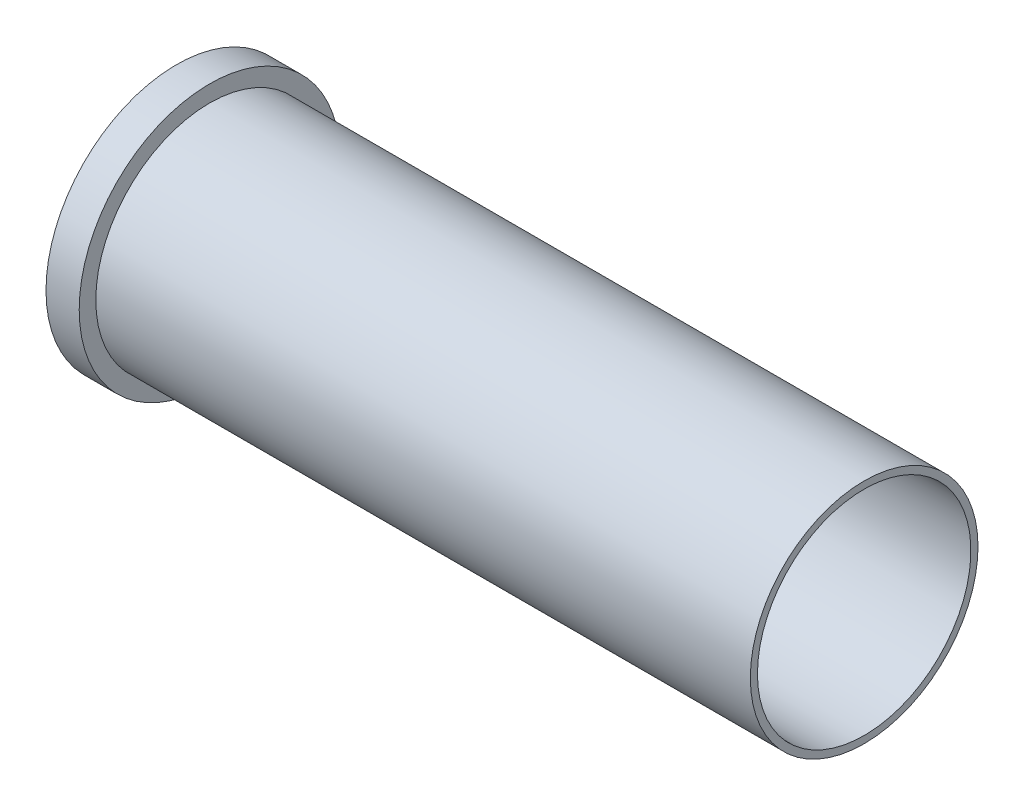
ISO-10303-21;
HEADER;
FILE_DESCRIPTION(('STEP AP214'),'2;1');
FILE_NAME('part.step','',(''),(''),'','','');
FILE_SCHEMA(('AUTOMOTIVE_DESIGN { 1 0 10303 214 1 1 1 1 }'));
ENDSEC;
DATA;
#1=APPLICATION_CONTEXT('core data for automotive mechanical design processes');
#2=APPLICATION_PROTOCOL_DEFINITION('international standard','automotive_design',2000,#1);
#3=PRODUCT_CONTEXT('',#1,'mechanical');
#4=PRODUCT('Part','Part','',(#3));
#5=PRODUCT_RELATED_PRODUCT_CATEGORY('part','',(#4));
#6=PRODUCT_DEFINITION_FORMATION('','',#4);
#7=PRODUCT_DEFINITION_CONTEXT('part definition',#1,'design');
#8=PRODUCT_DEFINITION('design','',#6,#7);
#9=PRODUCT_DEFINITION_SHAPE('','',#8);
#10=(LENGTH_UNIT() NAMED_UNIT(*) SI_UNIT(.MILLI.,.METRE.));
#11=(NAMED_UNIT(*) PLANE_ANGLE_UNIT() SI_UNIT($,.RADIAN.));
#12=(NAMED_UNIT(*) SI_UNIT($,.STERADIAN.) SOLID_ANGLE_UNIT());
#13=UNCERTAINTY_MEASURE_WITH_UNIT(LENGTH_MEASURE(1.E-05),#10,'distance_accuracy_value','');
#14=(GEOMETRIC_REPRESENTATION_CONTEXT(3) GLOBAL_UNCERTAINTY_ASSIGNED_CONTEXT((#13)) GLOBAL_UNIT_ASSIGNED_CONTEXT((#10,
#11,#12)) REPRESENTATION_CONTEXT('',''));
#15=CARTESIAN_POINT('',(0.,0.,0.));
#16=DIRECTION('',(0.,0.,1.));
#17=DIRECTION('',(1.,0.,0.));
#18=AXIS2_PLACEMENT_3D('',#15,#16,#17);
#19=CARTESIAN_POINT('',(0.,0.,0.));
#20=DIRECTION('',(-1.,0.,0.));
#21=DIRECTION('',(0.,0.,1.));
#22=AXIS2_PLACEMENT_3D('',#19,#20,#21);
#23=CYLINDRICAL_SURFACE('',#22,2.25);
#24=CARTESIAN_POINT('',(3.,0.,0.));
#25=DIRECTION('',(-1.,0.,0.));
#26=DIRECTION('',(0.,0.,1.));
#27=AXIS2_PLACEMENT_3D('',#24,#25,#26);
#28=CIRCLE('',#27,2.25);
#29=CARTESIAN_POINT('',(3.,0.,2.25));
#30=VERTEX_POINT('',#29);
#31=EDGE_CURVE('E66',#30,#30,#28,.T.);
#32=ORIENTED_EDGE('',*,*,#31,.F.);
#33=EDGE_LOOP('',(#32));
#34=FACE_BOUND('',#33,.T.);
#35=CARTESIAN_POINT('',(0.,0.,0.));
#36=DIRECTION('',(-1.,0.,0.));
#37=DIRECTION('',(0.,0.,1.));
#38=AXIS2_PLACEMENT_3D('',#35,#36,#37);
#39=CIRCLE('',#38,2.25);
#40=CARTESIAN_POINT('',(0.,0.,2.25));
#41=VERTEX_POINT('',#40);
#42=EDGE_CURVE('E10',#41,#41,#39,.T.);
#43=ORIENTED_EDGE('',*,*,#42,.T.);
#44=EDGE_LOOP('',(#43));
#45=FACE_BOUND('',#44,.T.);
#46=ADVANCED_FACE('F32',(#34,#45),#23,.F.);
#47=CARTESIAN_POINT('',(0.,0.,-2.25));
#48=DIRECTION('',(1.,0.,0.));
#49=DIRECTION('',(0.,0.,-1.));
#50=AXIS2_PLACEMENT_3D('',#47,#48,#49);
#51=PLANE('',#50);
#52=ORIENTED_EDGE('',*,*,#42,.F.);
#53=EDGE_LOOP('',(#52));
#54=FACE_BOUND('',#53,.T.);
#55=CARTESIAN_POINT('',(0.,0.,0.));
#56=DIRECTION('',(-1.,0.,0.));
#57=DIRECTION('',(0.,0.,1.));
#58=AXIS2_PLACEMENT_3D('',#55,#56,#57);
#59=CIRCLE('',#58,5.5);
#60=CARTESIAN_POINT('',(0.,0.,5.5));
#61=VERTEX_POINT('',#60);
#62=EDGE_CURVE('E38',#61,#61,#59,.T.);
#63=ORIENTED_EDGE('',*,*,#62,.T.);
#64=EDGE_LOOP('',(#63));
#65=FACE_BOUND('',#64,.T.);
#66=ADVANCED_FACE('F73',(#54,#65),#51,.F.);
#67=CARTESIAN_POINT('',(0.,0.,0.));
#68=DIRECTION('',(-1.,0.,0.));
#69=DIRECTION('',(0.,0.,1.));
#70=AXIS2_PLACEMENT_3D('',#67,#68,#69);
#71=CYLINDRICAL_SURFACE('',#70,5.5);
#72=ORIENTED_EDGE('',*,*,#62,.F.);
#73=EDGE_LOOP('',(#72));
#74=FACE_BOUND('',#73,.T.);
#75=CARTESIAN_POINT('',(1.4,0.,0.));
#76=DIRECTION('',(-1.,0.,0.));
#77=DIRECTION('',(0.,0.,1.));
#78=AXIS2_PLACEMENT_3D('',#75,#76,#77);
#79=CIRCLE('',#78,5.5);
#80=CARTESIAN_POINT('',(1.4,0.,5.5));
#81=VERTEX_POINT('',#80);
#82=EDGE_CURVE('E42',#81,#81,#79,.T.);
#83=ORIENTED_EDGE('',*,*,#82,.T.);
#84=EDGE_LOOP('',(#83));
#85=FACE_BOUND('',#84,.T.);
#86=ADVANCED_FACE('F77',(#74,#85),#71,.T.);
#87=CARTESIAN_POINT('',(1.4,0.,-5.5));
#88=DIRECTION('',(-1.,0.,0.));
#89=DIRECTION('',(0.,0.,1.));
#90=AXIS2_PLACEMENT_3D('',#87,#88,#89);
#91=PLANE('',#90);
#92=ORIENTED_EDGE('',*,*,#82,.F.);
#93=EDGE_LOOP('',(#92));
#94=FACE_BOUND('',#93,.T.);
#95=CARTESIAN_POINT('',(1.4,0.,0.));
#96=DIRECTION('',(-1.,0.,0.));
#97=DIRECTION('',(0.,0.,1.));
#98=AXIS2_PLACEMENT_3D('',#95,#96,#97);
#99=CIRCLE('',#98,4.8);
#100=CARTESIAN_POINT('',(1.4,0.,4.8));
#101=VERTEX_POINT('',#100);
#102=EDGE_CURVE('E46',#101,#101,#99,.T.);
#103=ORIENTED_EDGE('',*,*,#102,.T.);
#104=EDGE_LOOP('',(#103));
#105=FACE_BOUND('',#104,.T.);
#106=ADVANCED_FACE('F82',(#94,#105),#91,.F.);
#107=CARTESIAN_POINT('',(0.,0.,0.));
#108=DIRECTION('',(-1.,0.,0.));
#109=DIRECTION('',(0.,0.,1.));
#110=AXIS2_PLACEMENT_3D('',#107,#108,#109);
#111=CYLINDRICAL_SURFACE('',#110,4.8);
#112=ORIENTED_EDGE('',*,*,#102,.F.);
#113=EDGE_LOOP('',(#112));
#114=FACE_BOUND('',#113,.T.);
#115=CARTESIAN_POINT('',(29.,0.,0.));
#116=DIRECTION('',(-1.,0.,0.));
#117=DIRECTION('',(0.,0.,1.));
#118=AXIS2_PLACEMENT_3D('',#115,#116,#117);
#119=CIRCLE('',#118,4.8);
#120=CARTESIAN_POINT('',(29.,0.,4.8));
#121=VERTEX_POINT('',#120);
#122=EDGE_CURVE('E51',#121,#121,#119,.T.);
#123=ORIENTED_EDGE('',*,*,#122,.T.);
#124=EDGE_LOOP('',(#123));
#125=FACE_BOUND('',#124,.T.);
#126=ADVANCED_FACE('F88',(#114,#125),#111,.T.);
#127=CARTESIAN_POINT('',(29.,0.,-4.8));
#128=DIRECTION('',(-1.,0.,0.));
#129=DIRECTION('',(0.,0.,1.));
#130=AXIS2_PLACEMENT_3D('',#127,#128,#129);
#131=PLANE('',#130);
#132=ORIENTED_EDGE('',*,*,#122,.F.);
#133=EDGE_LOOP('',(#132));
#134=FACE_BOUND('',#133,.T.);
#135=CARTESIAN_POINT('',(29.,0.,0.));
#136=DIRECTION('',(-1.,0.,0.));
#137=DIRECTION('',(0.,0.,1.));
#138=AXIS2_PLACEMENT_3D('',#135,#136,#137);
#139=CIRCLE('',#138,4.5);
#140=CARTESIAN_POINT('',(29.,0.,4.5));
#141=VERTEX_POINT('',#140);
#142=EDGE_CURVE('E54',#141,#141,#139,.T.);
#143=ORIENTED_EDGE('',*,*,#142,.T.);
#144=EDGE_LOOP('',(#143));
#145=FACE_BOUND('',#144,.T.);
#146=ADVANCED_FACE('F92',(#134,#145),#131,.F.);
#147=CARTESIAN_POINT('',(0.,0.,0.));
#148=DIRECTION('',(-1.,0.,0.));
#149=DIRECTION('',(0.,0.,1.));
#150=AXIS2_PLACEMENT_3D('',#147,#148,#149);
#151=CYLINDRICAL_SURFACE('',#150,4.5);
#152=ORIENTED_EDGE('',*,*,#142,.F.);
#153=EDGE_LOOP('',(#152));
#154=FACE_BOUND('',#153,.T.);
#155=CARTESIAN_POINT('',(3.8,0.,0.));
#156=DIRECTION('',(-1.,0.,0.));
#157=DIRECTION('',(0.,0.,1.));
#158=AXIS2_PLACEMENT_3D('',#155,#156,#157);
#159=CIRCLE('',#158,4.5);
#160=CARTESIAN_POINT('',(3.8,0.,4.5));
#161=VERTEX_POINT('',#160);
#162=EDGE_CURVE('E57',#161,#161,#159,.T.);
#163=ORIENTED_EDGE('',*,*,#162,.T.);
#164=EDGE_LOOP('',(#163));
#165=FACE_BOUND('',#164,.T.);
#166=ADVANCED_FACE('F96',(#154,#165),#151,.F.);
#167=CARTESIAN_POINT('',(3.8,0.,-4.5));
#168=DIRECTION('',(-1.,0.,0.));
#169=DIRECTION('',(0.,0.,1.));
#170=AXIS2_PLACEMENT_3D('',#167,#168,#169);
#171=PLANE('',#170);
#172=ORIENTED_EDGE('',*,*,#162,.F.);
#173=EDGE_LOOP('',(#172));
#174=FACE_BOUND('',#173,.T.);
#175=CARTESIAN_POINT('',(3.8,0.,0.));
#176=DIRECTION('',(-1.,0.,0.));
#177=DIRECTION('',(0.,0.,1.));
#178=AXIS2_PLACEMENT_3D('',#175,#176,#177);
#179=CIRCLE('',#178,1.1);
#180=CARTESIAN_POINT('',(3.8,0.,1.1));
#181=VERTEX_POINT('',#180);
#182=EDGE_CURVE('E60',#181,#181,#179,.T.);
#183=ORIENTED_EDGE('',*,*,#182,.T.);
#184=EDGE_LOOP('',(#183));
#185=FACE_BOUND('',#184,.T.);
#186=ADVANCED_FACE('F100',(#174,#185),#171,.F.);
#187=CARTESIAN_POINT('',(0.,0.,0.));
#188=DIRECTION('',(-1.,0.,0.));
#189=DIRECTION('',(0.,0.,1.));
#190=AXIS2_PLACEMENT_3D('',#187,#188,#189);
#191=CYLINDRICAL_SURFACE('',#190,1.1);
#192=ORIENTED_EDGE('',*,*,#182,.F.);
#193=EDGE_LOOP('',(#192));
#194=FACE_BOUND('',#193,.T.);
#195=CARTESIAN_POINT('',(3.,0.,0.));
#196=DIRECTION('',(-1.,0.,0.));
#197=DIRECTION('',(0.,0.,1.));
#198=AXIS2_PLACEMENT_3D('',#195,#196,#197);
#199=CIRCLE('',#198,1.1);
#200=CARTESIAN_POINT('',(3.,0.,1.1));
#201=VERTEX_POINT('',#200);
#202=EDGE_CURVE('E63',#201,#201,#199,.T.);
#203=ORIENTED_EDGE('',*,*,#202,.T.);
#204=EDGE_LOOP('',(#203));
#205=FACE_BOUND('',#204,.T.);
#206=ADVANCED_FACE('F104',(#194,#205),#191,.F.);
#207=CARTESIAN_POINT('',(3.,0.,-1.1));
#208=DIRECTION('',(1.,0.,0.));
#209=DIRECTION('',(0.,0.,-1.));
#210=AXIS2_PLACEMENT_3D('',#207,#208,#209);
#211=PLANE('',#210);
#212=ORIENTED_EDGE('',*,*,#202,.F.);
#213=EDGE_LOOP('',(#212));
#214=FACE_BOUND('',#213,.T.);
#215=ORIENTED_EDGE('',*,*,#31,.T.);
#216=EDGE_LOOP('',(#215));
#217=FACE_BOUND('',#216,.T.);
#218=ADVANCED_FACE('F70',(#214,#217),#211,.F.);
#219=CLOSED_SHELL('',(#46,#66,#86,#106,#126,#146,#166,#186,#206,#218));
#220=MANIFOLD_SOLID_BREP('B2',#219);
#221=ADVANCED_BREP_SHAPE_REPRESENTATION('',(#18,#220),#14);
#222=SHAPE_DEFINITION_REPRESENTATION(#9,#221);
ENDSEC;
END-ISO-10303-21;
